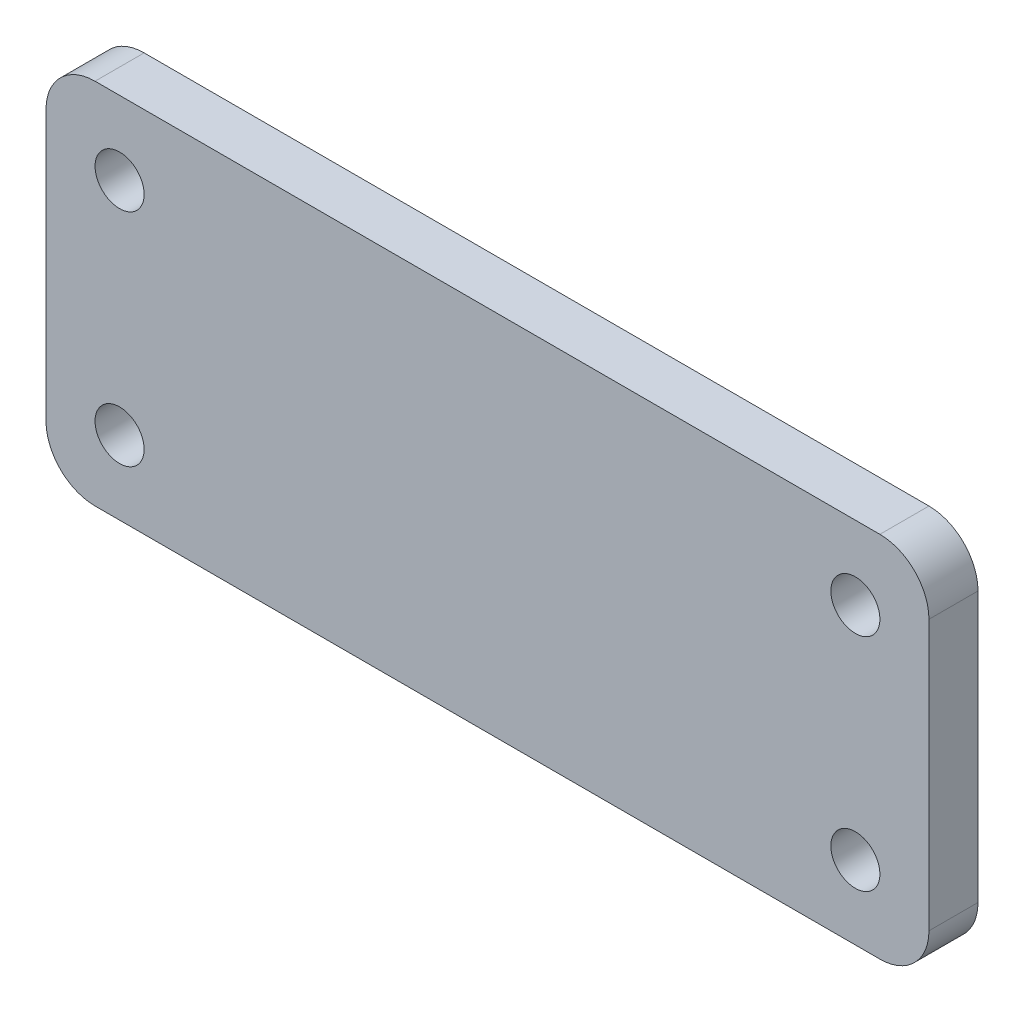
ISO-10303-21;
HEADER;
FILE_DESCRIPTION(('STEP AP214'),'2;1');
FILE_NAME('part.step','',(''),(''),'','','');
FILE_SCHEMA(('AUTOMOTIVE_DESIGN { 1 0 10303 214 1 1 1 1 }'));
ENDSEC;
DATA;
#1=APPLICATION_CONTEXT('core data for automotive mechanical design processes');
#2=APPLICATION_PROTOCOL_DEFINITION('international standard','automotive_design',2000,#1);
#3=PRODUCT_CONTEXT('',#1,'mechanical');
#4=PRODUCT('Part','Part','',(#3));
#5=PRODUCT_RELATED_PRODUCT_CATEGORY('part','',(#4));
#6=PRODUCT_DEFINITION_FORMATION('','',#4);
#7=PRODUCT_DEFINITION_CONTEXT('part definition',#1,'design');
#8=PRODUCT_DEFINITION('design','',#6,#7);
#9=PRODUCT_DEFINITION_SHAPE('','',#8);
#10=(LENGTH_UNIT() NAMED_UNIT(*) SI_UNIT(.MILLI.,.METRE.));
#11=(NAMED_UNIT(*) PLANE_ANGLE_UNIT() SI_UNIT($,.RADIAN.));
#12=(NAMED_UNIT(*) SI_UNIT($,.STERADIAN.) SOLID_ANGLE_UNIT());
#13=UNCERTAINTY_MEASURE_WITH_UNIT(LENGTH_MEASURE(1.E-05),#10,'distance_accuracy_value','');
#14=(GEOMETRIC_REPRESENTATION_CONTEXT(3) GLOBAL_UNCERTAINTY_ASSIGNED_CONTEXT((#13)) GLOBAL_UNIT_ASSIGNED_CONTEXT((#10,
#11,#12)) REPRESENTATION_CONTEXT('',''));
#15=CARTESIAN_POINT('',(0.,0.,0.));
#16=DIRECTION('',(0.,0.,1.));
#17=DIRECTION('',(1.,0.,0.));
#18=AXIS2_PLACEMENT_3D('',#15,#16,#17);
#19=CARTESIAN_POINT('',(170.,-65.,10.));
#20=DIRECTION('',(0.,0.,1.));
#21=DIRECTION('',(1.,0.,0.));
#22=AXIS2_PLACEMENT_3D('',#19,#20,#21);
#23=PLANE('',#22);
#24=CARTESIAN_POINT('',(165.,-60.,10.));
#25=DIRECTION('',(0.,0.,1.));
#26=DIRECTION('',(1.,0.,0.));
#27=AXIS2_PLACEMENT_3D('',#24,#25,#26);
#28=CIRCLE('',#27,5.00000000000002);
#29=CARTESIAN_POINT('',(170.,-60.,10.));
#30=VERTEX_POINT('',#29);
#31=EDGE_CURVE('E252',#30,#30,#28,.T.);
#32=ORIENTED_EDGE('',*,*,#31,.F.);
#33=EDGE_LOOP('',(#32));
#34=FACE_BOUND('',#33,.T.);
#35=CARTESIAN_POINT('',(15.,-15.,10.));
#36=DIRECTION('',(0.,0.,1.));
#37=DIRECTION('',(1.,0.,0.));
#38=AXIS2_PLACEMENT_3D('',#35,#36,#37);
#39=CIRCLE('',#38,5.);
#40=CARTESIAN_POINT('',(20.,-15.,10.));
#41=VERTEX_POINT('',#40);
#42=EDGE_CURVE('E145',#41,#41,#39,.T.);
#43=ORIENTED_EDGE('',*,*,#42,.F.);
#44=EDGE_LOOP('',(#43));
#45=FACE_BOUND('',#44,.T.);
#46=DIRECTION('',(0.,-1.,0.));
#47=VECTOR('',#46,1.);
#48=CARTESIAN_POINT('',(180.,-10.0000000000001,10.));
#49=LINE('',#48,#47);
#50=CARTESIAN_POINT('',(180.,-10.0000000000001,10.));
#51=VERTEX_POINT('',#50);
#52=CARTESIAN_POINT('',(180.,-65.,10.));
#53=VERTEX_POINT('',#52);
#54=EDGE_CURVE('E166',#51,#53,#49,.T.);
#55=ORIENTED_EDGE('',*,*,#54,.F.);
#56=CARTESIAN_POINT('',(170.,-10.,10.));
#57=DIRECTION('',(0.,0.,-1.));
#58=DIRECTION('',(-1.,0.,0.));
#59=AXIS2_PLACEMENT_3D('',#56,#57,#58);
#60=CIRCLE('',#59,10.);
#61=CARTESIAN_POINT('',(170.,0.,10.));
#62=VERTEX_POINT('',#61);
#63=EDGE_CURVE('E133',#62,#51,#60,.T.);
#64=ORIENTED_EDGE('',*,*,#63,.F.);
#65=DIRECTION('',(1.,0.,0.));
#66=VECTOR('',#65,1.);
#67=CARTESIAN_POINT('',(10.0000000000001,0.,10.));
#68=LINE('',#67,#66);
#69=CARTESIAN_POINT('',(10.0000000000001,0.,10.));
#70=VERTEX_POINT('',#69);
#71=EDGE_CURVE('E116',#70,#62,#68,.T.);
#72=ORIENTED_EDGE('',*,*,#71,.F.);
#73=CARTESIAN_POINT('',(10.,-10.,10.));
#74=DIRECTION('',(0.,0.,1.));
#75=DIRECTION('',(1.,0.,0.));
#76=AXIS2_PLACEMENT_3D('',#73,#74,#75);
#77=CIRCLE('',#76,10.);
#78=CARTESIAN_POINT('',(0.,-10.0000000000001,10.));
#79=VERTEX_POINT('',#78);
#80=EDGE_CURVE('E125',#70,#79,#77,.T.);
#81=ORIENTED_EDGE('',*,*,#80,.T.);
#82=DIRECTION('',(0.,-1.,0.));
#83=VECTOR('',#82,1.);
#84=CARTESIAN_POINT('',(0.,-10.0000000000001,10.));
#85=LINE('',#84,#83);
#86=CARTESIAN_POINT('',(0.,-64.9999999999999,10.));
#87=VERTEX_POINT('',#86);
#88=EDGE_CURVE('E130',#79,#87,#85,.T.);
#89=ORIENTED_EDGE('',*,*,#88,.T.);
#90=CARTESIAN_POINT('',(10.,-65.,10.));
#91=DIRECTION('',(0.,0.,1.));
#92=DIRECTION('',(1.,0.,0.));
#93=AXIS2_PLACEMENT_3D('',#90,#91,#92);
#94=CIRCLE('',#93,10.);
#95=CARTESIAN_POINT('',(10.0000000000001,-75.,10.));
#96=VERTEX_POINT('',#95);
#97=EDGE_CURVE('E269',#87,#96,#94,.T.);
#98=ORIENTED_EDGE('',*,*,#97,.T.);
#99=DIRECTION('',(1.,0.,0.));
#100=VECTOR('',#99,1.);
#101=CARTESIAN_POINT('',(10.0000000000001,-75.,10.));
#102=LINE('',#101,#100);
#103=CARTESIAN_POINT('',(170.,-75.,10.));
#104=VERTEX_POINT('',#103);
#105=EDGE_CURVE('E266',#96,#104,#102,.T.);
#106=ORIENTED_EDGE('',*,*,#105,.T.);
#107=CARTESIAN_POINT('',(170.,-65.,10.));
#108=DIRECTION('',(0.,0.,1.));
#109=DIRECTION('',(1.,0.,0.));
#110=AXIS2_PLACEMENT_3D('',#107,#108,#109);
#111=CIRCLE('',#110,10.);
#112=EDGE_CURVE('E99',#104,#53,#111,.T.);
#113=ORIENTED_EDGE('',*,*,#112,.T.);
#114=EDGE_LOOP('',(#55,#64,#72,#81,#89,#98,#106,#113));
#115=FACE_BOUND('',#114,.T.);
#116=CARTESIAN_POINT('',(15.,-60.,10.));
#117=DIRECTION('',(0.,0.,-1.));
#118=DIRECTION('',(-1.,0.,0.));
#119=AXIS2_PLACEMENT_3D('',#116,#117,#118);
#120=CIRCLE('',#119,5.);
#121=CARTESIAN_POINT('',(10.,-60.,10.));
#122=VERTEX_POINT('',#121);
#123=EDGE_CURVE('E242',#122,#122,#120,.T.);
#124=ORIENTED_EDGE('',*,*,#123,.T.);
#125=EDGE_LOOP('',(#124));
#126=FACE_BOUND('',#125,.T.);
#127=CARTESIAN_POINT('',(165.,-15.,10.));
#128=DIRECTION('',(0.,0.,-1.));
#129=DIRECTION('',(-1.,0.,0.));
#130=AXIS2_PLACEMENT_3D('',#127,#128,#129);
#131=CIRCLE('',#130,5.00000000000002);
#132=CARTESIAN_POINT('',(160.,-15.,10.));
#133=VERTEX_POINT('',#132);
#134=EDGE_CURVE('E230',#133,#133,#131,.T.);
#135=ORIENTED_EDGE('',*,*,#134,.T.);
#136=EDGE_LOOP('',(#135));
#137=FACE_BOUND('',#136,.T.);
#138=ADVANCED_FACE('F41',(#34,#45,#115,#126,#137),#23,.T.);
#139=CARTESIAN_POINT('',(170.,-65.,0.));
#140=DIRECTION('',(0.,0.,1.));
#141=DIRECTION('',(1.,0.,0.));
#142=AXIS2_PLACEMENT_3D('',#139,#140,#141);
#143=PLANE('',#142);
#144=CARTESIAN_POINT('',(15.,-60.,0.));
#145=DIRECTION('',(0.,0.,-1.));
#146=DIRECTION('',(-1.,0.,0.));
#147=AXIS2_PLACEMENT_3D('',#144,#145,#146);
#148=CIRCLE('',#147,5.);
#149=CARTESIAN_POINT('',(10.,-60.,0.));
#150=VERTEX_POINT('',#149);
#151=EDGE_CURVE('E235',#150,#150,#148,.T.);
#152=ORIENTED_EDGE('',*,*,#151,.F.);
#153=EDGE_LOOP('',(#152));
#154=FACE_BOUND('',#153,.T.);
#155=CARTESIAN_POINT('',(165.,-60.,0.));
#156=DIRECTION('',(0.,0.,1.));
#157=DIRECTION('',(1.,0.,0.));
#158=AXIS2_PLACEMENT_3D('',#155,#156,#157);
#159=CIRCLE('',#158,5.00000000000002);
#160=CARTESIAN_POINT('',(170.,-60.,0.));
#161=VERTEX_POINT('',#160);
#162=EDGE_CURVE('E248',#161,#161,#159,.T.);
#163=ORIENTED_EDGE('',*,*,#162,.T.);
#164=EDGE_LOOP('',(#163));
#165=FACE_BOUND('',#164,.T.);
#166=CARTESIAN_POINT('',(15.,-15.,0.));
#167=DIRECTION('',(0.,0.,1.));
#168=DIRECTION('',(1.,0.,0.));
#169=AXIS2_PLACEMENT_3D('',#166,#167,#168);
#170=CIRCLE('',#169,5.);
#171=CARTESIAN_POINT('',(20.,-15.,0.));
#172=VERTEX_POINT('',#171);
#173=EDGE_CURVE('E239',#172,#172,#170,.T.);
#174=ORIENTED_EDGE('',*,*,#173,.T.);
#175=EDGE_LOOP('',(#174));
#176=FACE_BOUND('',#175,.T.);
#177=DIRECTION('',(0.,-1.,0.));
#178=VECTOR('',#177,1.);
#179=CARTESIAN_POINT('',(180.,-10.0000000000001,0.));
#180=LINE('',#179,#178);
#181=CARTESIAN_POINT('',(180.,-10.0000000000001,0.));
#182=VERTEX_POINT('',#181);
#183=CARTESIAN_POINT('',(180.,-65.,0.));
#184=VERTEX_POINT('',#183);
#185=EDGE_CURVE('E140',#182,#184,#180,.T.);
#186=ORIENTED_EDGE('',*,*,#185,.T.);
#187=CARTESIAN_POINT('',(170.,-65.,0.));
#188=DIRECTION('',(0.,0.,1.));
#189=DIRECTION('',(1.,0.,0.));
#190=AXIS2_PLACEMENT_3D('',#187,#188,#189);
#191=CIRCLE('',#190,10.);
#192=CARTESIAN_POINT('',(170.,-75.,0.));
#193=VERTEX_POINT('',#192);
#194=EDGE_CURVE('E144',#193,#184,#191,.T.);
#195=ORIENTED_EDGE('',*,*,#194,.F.);
#196=DIRECTION('',(1.,0.,0.));
#197=VECTOR('',#196,1.);
#198=CARTESIAN_POINT('',(10.0000000000001,-75.,0.));
#199=LINE('',#198,#197);
#200=CARTESIAN_POINT('',(10.0000000000001,-75.,0.));
#201=VERTEX_POINT('',#200);
#202=EDGE_CURVE('E149',#201,#193,#199,.T.);
#203=ORIENTED_EDGE('',*,*,#202,.F.);
#204=CARTESIAN_POINT('',(10.,-65.,0.));
#205=DIRECTION('',(0.,0.,1.));
#206=DIRECTION('',(1.,0.,0.));
#207=AXIS2_PLACEMENT_3D('',#204,#205,#206);
#208=CIRCLE('',#207,10.);
#209=CARTESIAN_POINT('',(0.,-64.9999999999999,0.));
#210=VERTEX_POINT('',#209);
#211=EDGE_CURVE('E152',#210,#201,#208,.T.);
#212=ORIENTED_EDGE('',*,*,#211,.F.);
#213=DIRECTION('',(0.,-1.,0.));
#214=VECTOR('',#213,1.);
#215=CARTESIAN_POINT('',(0.,-10.0000000000001,0.));
#216=LINE('',#215,#214);
#217=CARTESIAN_POINT('',(0.,-10.0000000000001,0.));
#218=VERTEX_POINT('',#217);
#219=EDGE_CURVE('E155',#218,#210,#216,.T.);
#220=ORIENTED_EDGE('',*,*,#219,.F.);
#221=CARTESIAN_POINT('',(10.,-10.,0.));
#222=DIRECTION('',(0.,0.,1.));
#223=DIRECTION('',(1.,0.,0.));
#224=AXIS2_PLACEMENT_3D('',#221,#222,#223);
#225=CIRCLE('',#224,10.);
#226=CARTESIAN_POINT('',(10.0000000000001,0.,0.));
#227=VERTEX_POINT('',#226);
#228=EDGE_CURVE('E158',#227,#218,#225,.T.);
#229=ORIENTED_EDGE('',*,*,#228,.F.);
#230=DIRECTION('',(1.,0.,0.));
#231=VECTOR('',#230,1.);
#232=CARTESIAN_POINT('',(10.0000000000001,0.,0.));
#233=LINE('',#232,#231);
#234=CARTESIAN_POINT('',(170.,0.,0.));
#235=VERTEX_POINT('',#234);
#236=EDGE_CURVE('E118',#227,#235,#233,.T.);
#237=ORIENTED_EDGE('',*,*,#236,.T.);
#238=CARTESIAN_POINT('',(170.,-10.,0.));
#239=DIRECTION('',(0.,0.,-1.));
#240=DIRECTION('',(-1.,0.,0.));
#241=AXIS2_PLACEMENT_3D('',#238,#239,#240);
#242=CIRCLE('',#241,10.);
#243=EDGE_CURVE('E163',#235,#182,#242,.T.);
#244=ORIENTED_EDGE('',*,*,#243,.T.);
#245=EDGE_LOOP('',(#186,#195,#203,#212,#220,#229,#237,#244));
#246=FACE_BOUND('',#245,.T.);
#247=CARTESIAN_POINT('',(165.,-15.,0.));
#248=DIRECTION('',(0.,0.,-1.));
#249=DIRECTION('',(-1.,0.,0.));
#250=AXIS2_PLACEMENT_3D('',#247,#248,#249);
#251=CIRCLE('',#250,5.00000000000002);
#252=CARTESIAN_POINT('',(160.,-15.,0.));
#253=VERTEX_POINT('',#252);
#254=EDGE_CURVE('E233',#253,#253,#251,.T.);
#255=ORIENTED_EDGE('',*,*,#254,.F.);
#256=EDGE_LOOP('',(#255));
#257=FACE_BOUND('',#256,.T.);
#258=ADVANCED_FACE('F189',(#154,#165,#176,#246,#257),#143,.F.);
#259=CARTESIAN_POINT('',(180.,-10.0000000000001,10.));
#260=DIRECTION('',(1.,0.,0.));
#261=DIRECTION('',(0.,0.,-1.));
#262=AXIS2_PLACEMENT_3D('',#259,#260,#261);
#263=PLANE('',#262);
#264=ORIENTED_EDGE('',*,*,#185,.F.);
#265=DIRECTION('',(0.,0.,-1.));
#266=VECTOR('',#265,1.);
#267=CARTESIAN_POINT('',(180.,-10.0000000000001,10.));
#268=LINE('',#267,#266);
#269=EDGE_CURVE('E11',#51,#182,#268,.T.);
#270=ORIENTED_EDGE('',*,*,#269,.F.);
#271=ORIENTED_EDGE('',*,*,#54,.T.);
#272=DIRECTION('',(0.,0.,-1.));
#273=VECTOR('',#272,1.);
#274=CARTESIAN_POINT('',(180.,-65.,10.));
#275=LINE('',#274,#273);
#276=EDGE_CURVE('E45',#53,#184,#275,.T.);
#277=ORIENTED_EDGE('',*,*,#276,.T.);
#278=EDGE_LOOP('',(#264,#270,#271,#277));
#279=FACE_BOUND('',#278,.T.);
#280=ADVANCED_FACE('F43',(#279),#263,.T.);
#281=CARTESIAN_POINT('',(170.,-10.,10.));
#282=DIRECTION('',(0.,0.,-1.));
#283=DIRECTION('',(-1.,0.,0.));
#284=AXIS2_PLACEMENT_3D('',#281,#282,#283);
#285=CYLINDRICAL_SURFACE('',#284,10.);
#286=ORIENTED_EDGE('',*,*,#243,.F.);
#287=DIRECTION('',(0.,0.,-1.));
#288=VECTOR('',#287,1.);
#289=CARTESIAN_POINT('',(170.,0.,10.));
#290=LINE('',#289,#288);
#291=EDGE_CURVE('E52',#62,#235,#290,.T.);
#292=ORIENTED_EDGE('',*,*,#291,.F.);
#293=ORIENTED_EDGE('',*,*,#63,.T.);
#294=ORIENTED_EDGE('',*,*,#269,.T.);
#295=EDGE_LOOP('',(#286,#292,#293,#294));
#296=FACE_BOUND('',#295,.T.);
#297=ADVANCED_FACE('F191',(#296),#285,.T.);
#298=CARTESIAN_POINT('',(10.0000000000001,0.,10.));
#299=DIRECTION('',(0.,1.,0.));
#300=DIRECTION('',(0.,0.,1.));
#301=AXIS2_PLACEMENT_3D('',#298,#299,#300);
#302=PLANE('',#301);
#303=ORIENTED_EDGE('',*,*,#236,.F.);
#304=DIRECTION('',(0.,0.,-1.));
#305=VECTOR('',#304,1.);
#306=CARTESIAN_POINT('',(10.0000000000001,0.,10.));
#307=LINE('',#306,#305);
#308=EDGE_CURVE('E112',#70,#227,#307,.T.);
#309=ORIENTED_EDGE('',*,*,#308,.F.);
#310=ORIENTED_EDGE('',*,*,#71,.T.);
#311=ORIENTED_EDGE('',*,*,#291,.T.);
#312=EDGE_LOOP('',(#303,#309,#310,#311));
#313=FACE_BOUND('',#312,.T.);
#314=ADVANCED_FACE('F114',(#313),#302,.T.);
#315=CARTESIAN_POINT('',(10.,-10.,10.));
#316=DIRECTION('',(0.,0.,-1.));
#317=DIRECTION('',(-1.,0.,0.));
#318=AXIS2_PLACEMENT_3D('',#315,#316,#317);
#319=CYLINDRICAL_SURFACE('',#318,10.);
#320=ORIENTED_EDGE('',*,*,#228,.T.);
#321=DIRECTION('',(0.,0.,-1.));
#322=VECTOR('',#321,1.);
#323=CARTESIAN_POINT('',(0.,-10.0000000000001,10.));
#324=LINE('',#323,#322);
#325=EDGE_CURVE('E122',#79,#218,#324,.T.);
#326=ORIENTED_EDGE('',*,*,#325,.F.);
#327=ORIENTED_EDGE('',*,*,#80,.F.);
#328=ORIENTED_EDGE('',*,*,#308,.T.);
#329=EDGE_LOOP('',(#320,#326,#327,#328));
#330=FACE_BOUND('',#329,.T.);
#331=ADVANCED_FACE('F126',(#330),#319,.T.);
#332=CARTESIAN_POINT('',(0.,-10.0000000000001,10.));
#333=DIRECTION('',(1.,0.,0.));
#334=DIRECTION('',(0.,1.,0.));
#335=AXIS2_PLACEMENT_3D('',#332,#333,#334);
#336=PLANE('',#335);
#337=ORIENTED_EDGE('',*,*,#219,.T.);
#338=DIRECTION('',(0.,0.,-1.));
#339=VECTOR('',#338,1.);
#340=CARTESIAN_POINT('',(0.,-64.9999999999999,10.));
#341=LINE('',#340,#339);
#342=EDGE_CURVE('E172',#87,#210,#341,.T.);
#343=ORIENTED_EDGE('',*,*,#342,.F.);
#344=ORIENTED_EDGE('',*,*,#88,.F.);
#345=ORIENTED_EDGE('',*,*,#325,.T.);
#346=EDGE_LOOP('',(#337,#343,#344,#345));
#347=FACE_BOUND('',#346,.T.);
#348=ADVANCED_FACE('F276',(#347),#336,.F.);
#349=CARTESIAN_POINT('',(10.,-65.,10.));
#350=DIRECTION('',(0.,0.,-1.));
#351=DIRECTION('',(-1.,0.,0.));
#352=AXIS2_PLACEMENT_3D('',#349,#350,#351);
#353=CYLINDRICAL_SURFACE('',#352,10.);
#354=ORIENTED_EDGE('',*,*,#211,.T.);
#355=DIRECTION('',(0.,0.,-1.));
#356=VECTOR('',#355,1.);
#357=CARTESIAN_POINT('',(10.0000000000001,-75.,10.));
#358=LINE('',#357,#356);
#359=EDGE_CURVE('E176',#96,#201,#358,.T.);
#360=ORIENTED_EDGE('',*,*,#359,.F.);
#361=ORIENTED_EDGE('',*,*,#97,.F.);
#362=ORIENTED_EDGE('',*,*,#342,.T.);
#363=EDGE_LOOP('',(#354,#360,#361,#362));
#364=FACE_BOUND('',#363,.T.);
#365=ADVANCED_FACE('F280',(#364),#353,.T.);
#366=CARTESIAN_POINT('',(10.0000000000001,-75.,10.));
#367=DIRECTION('',(0.,1.,0.));
#368=DIRECTION('',(0.,0.,1.));
#369=AXIS2_PLACEMENT_3D('',#366,#367,#368);
#370=PLANE('',#369);
#371=ORIENTED_EDGE('',*,*,#202,.T.);
#372=DIRECTION('',(0.,0.,-1.));
#373=VECTOR('',#372,1.);
#374=CARTESIAN_POINT('',(170.,-75.,10.));
#375=LINE('',#374,#373);
#376=EDGE_CURVE('E179',#104,#193,#375,.T.);
#377=ORIENTED_EDGE('',*,*,#376,.F.);
#378=ORIENTED_EDGE('',*,*,#105,.F.);
#379=ORIENTED_EDGE('',*,*,#359,.T.);
#380=EDGE_LOOP('',(#371,#377,#378,#379));
#381=FACE_BOUND('',#380,.T.);
#382=ADVANCED_FACE('F283',(#381),#370,.F.);
#383=CARTESIAN_POINT('',(170.,-65.,10.));
#384=DIRECTION('',(0.,0.,-1.));
#385=DIRECTION('',(-1.,0.,0.));
#386=AXIS2_PLACEMENT_3D('',#383,#384,#385);
#387=CYLINDRICAL_SURFACE('',#386,10.);
#388=ORIENTED_EDGE('',*,*,#194,.T.);
#389=ORIENTED_EDGE('',*,*,#276,.F.);
#390=ORIENTED_EDGE('',*,*,#112,.F.);
#391=ORIENTED_EDGE('',*,*,#376,.T.);
#392=EDGE_LOOP('',(#388,#389,#390,#391));
#393=FACE_BOUND('',#392,.T.);
#394=ADVANCED_FACE('F186',(#393),#387,.T.);
#395=CARTESIAN_POINT('',(15.,-15.,10.));
#396=DIRECTION('',(0.,0.,-1.));
#397=DIRECTION('',(-1.,0.,0.));
#398=AXIS2_PLACEMENT_3D('',#395,#396,#397);
#399=CYLINDRICAL_SURFACE('',#398,5.);
#400=ORIENTED_EDGE('',*,*,#42,.T.);
#401=EDGE_LOOP('',(#400));
#402=FACE_BOUND('',#401,.T.);
#403=ORIENTED_EDGE('',*,*,#173,.F.);
#404=EDGE_LOOP('',(#403));
#405=FACE_BOUND('',#404,.T.);
#406=ADVANCED_FACE('F210',(#402,#405),#399,.F.);
#407=CARTESIAN_POINT('',(165.,-60.,10.));
#408=DIRECTION('',(0.,0.,-1.));
#409=DIRECTION('',(-1.,0.,0.));
#410=AXIS2_PLACEMENT_3D('',#407,#408,#409);
#411=CYLINDRICAL_SURFACE('',#410,5.00000000000002);
#412=ORIENTED_EDGE('',*,*,#31,.T.);
#413=EDGE_LOOP('',(#412));
#414=FACE_BOUND('',#413,.T.);
#415=ORIENTED_EDGE('',*,*,#162,.F.);
#416=EDGE_LOOP('',(#415));
#417=FACE_BOUND('',#416,.T.);
#418=ADVANCED_FACE('F213',(#414,#417),#411,.F.);
#419=CARTESIAN_POINT('',(15.,-60.,10.));
#420=DIRECTION('',(0.,0.,-1.));
#421=DIRECTION('',(-1.,0.,0.));
#422=AXIS2_PLACEMENT_3D('',#419,#420,#421);
#423=CYLINDRICAL_SURFACE('',#422,5.);
#424=ORIENTED_EDGE('',*,*,#123,.F.);
#425=EDGE_LOOP('',(#424));
#426=FACE_BOUND('',#425,.T.);
#427=ORIENTED_EDGE('',*,*,#151,.T.);
#428=EDGE_LOOP('',(#427));
#429=FACE_BOUND('',#428,.T.);
#430=ADVANCED_FACE('F217',(#426,#429),#423,.F.);
#431=CARTESIAN_POINT('',(165.,-15.,10.));
#432=DIRECTION('',(0.,0.,-1.));
#433=DIRECTION('',(-1.,0.,0.));
#434=AXIS2_PLACEMENT_3D('',#431,#432,#433);
#435=CYLINDRICAL_SURFACE('',#434,5.00000000000002);
#436=ORIENTED_EDGE('',*,*,#134,.F.);
#437=EDGE_LOOP('',(#436));
#438=FACE_BOUND('',#437,.T.);
#439=ORIENTED_EDGE('',*,*,#254,.T.);
#440=EDGE_LOOP('',(#439));
#441=FACE_BOUND('',#440,.T.);
#442=ADVANCED_FACE('F221',(#438,#441),#435,.F.);
#443=CLOSED_SHELL('',(#138,#258,#280,#297,#314,#331,#348,#365,#382,#394,#406,#418,#430,#442));
#444=MANIFOLD_SOLID_BREP('B2',#443);
#445=ADVANCED_BREP_SHAPE_REPRESENTATION('',(#18,#444),#14);
#446=SHAPE_DEFINITION_REPRESENTATION(#9,#445);
ENDSEC;
END-ISO-10303-21;
